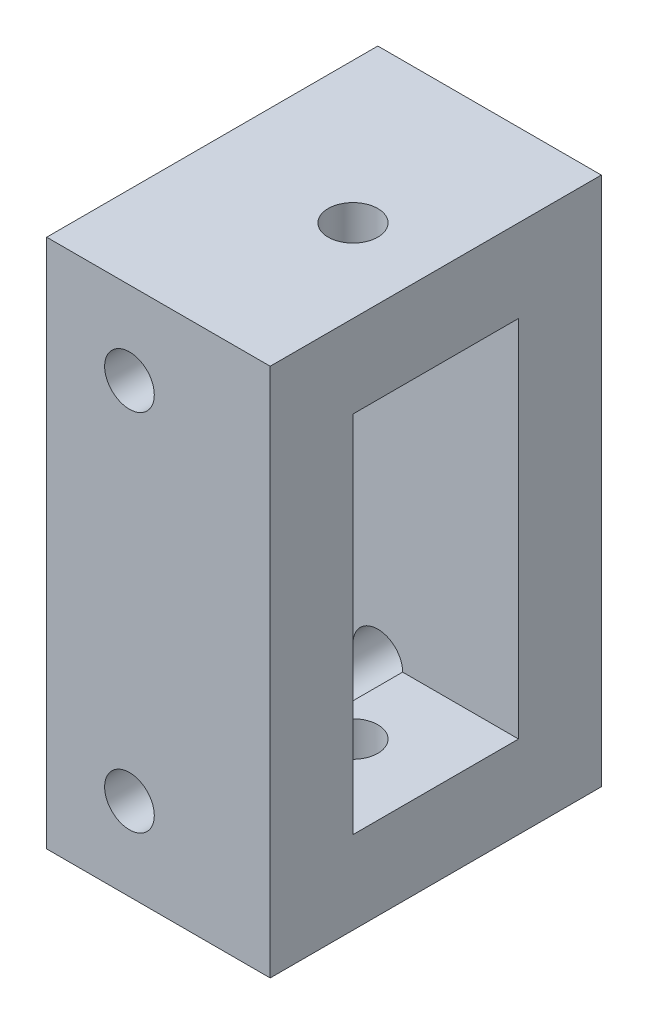
ISO-10303-21;
HEADER;
FILE_DESCRIPTION(('STEP AP214'),'2;1');
FILE_NAME('part.step','',(''),(''),'','','');
FILE_SCHEMA(('AUTOMOTIVE_DESIGN { 1 0 10303 214 1 1 1 1 }'));
ENDSEC;
DATA;
#1=APPLICATION_CONTEXT('core data for automotive mechanical design processes');
#2=APPLICATION_PROTOCOL_DEFINITION('international standard','automotive_design',2000,#1);
#3=PRODUCT_CONTEXT('',#1,'mechanical');
#4=PRODUCT('Part','Part','',(#3));
#5=PRODUCT_RELATED_PRODUCT_CATEGORY('part','',(#4));
#6=PRODUCT_DEFINITION_FORMATION('','',#4);
#7=PRODUCT_DEFINITION_CONTEXT('part definition',#1,'design');
#8=PRODUCT_DEFINITION('design','',#6,#7);
#9=PRODUCT_DEFINITION_SHAPE('','',#8);
#10=(LENGTH_UNIT() NAMED_UNIT(*) SI_UNIT(.MILLI.,.METRE.));
#11=(NAMED_UNIT(*) PLANE_ANGLE_UNIT() SI_UNIT($,.RADIAN.));
#12=(NAMED_UNIT(*) SI_UNIT($,.STERADIAN.) SOLID_ANGLE_UNIT());
#13=UNCERTAINTY_MEASURE_WITH_UNIT(LENGTH_MEASURE(1.E-05),#10,'distance_accuracy_value','');
#14=(GEOMETRIC_REPRESENTATION_CONTEXT(3) GLOBAL_UNCERTAINTY_ASSIGNED_CONTEXT((#13)) GLOBAL_UNIT_ASSIGNED_CONTEXT((#10,
#11,#12)) REPRESENTATION_CONTEXT('',''));
#15=CARTESIAN_POINT('',(0.,0.,0.));
#16=DIRECTION('',(0.,0.,1.));
#17=DIRECTION('',(1.,0.,0.));
#18=AXIS2_PLACEMENT_3D('',#15,#16,#17);
#19=CARTESIAN_POINT('',(8.5,0.,10.));
#20=DIRECTION('',(0.,1.,0.));
#21=DIRECTION('',(0.,0.,1.));
#22=AXIS2_PLACEMENT_3D('',#19,#20,#21);
#23=CYLINDRICAL_SURFACE('',#22,1.5);
#24=CARTESIAN_POINT('',(8.5,27.,10.));
#25=DIRECTION('',(0.,1.,0.));
#26=DIRECTION('',(0.,0.,1.));
#27=AXIS2_PLACEMENT_3D('',#24,#25,#26);
#28=CIRCLE('',#27,1.5);
#29=CARTESIAN_POINT('',(8.5,27.,11.5));
#30=VERTEX_POINT('',#29);
#31=EDGE_CURVE('E172',#30,#30,#28,.F.);
#32=ORIENTED_EDGE('',*,*,#31,.T.);
#33=EDGE_LOOP('',(#32));
#34=FACE_BOUND('',#33,.T.);
#35=CARTESIAN_POINT('',(8.5,32.,10.));
#36=DIRECTION('',(0.,1.,0.));
#37=DIRECTION('',(0.,0.,1.));
#38=AXIS2_PLACEMENT_3D('',#35,#36,#37);
#39=CIRCLE('',#38,1.5);
#40=CARTESIAN_POINT('',(8.5,32.,11.5));
#41=VERTEX_POINT('',#40);
#42=EDGE_CURVE('E185',#41,#41,#39,.T.);
#43=ORIENTED_EDGE('',*,*,#42,.T.);
#44=EDGE_LOOP('',(#43));
#45=FACE_BOUND('',#44,.T.);
#46=ADVANCED_FACE('F33',(#34,#45),#23,.F.);
#47=CARTESIAN_POINT('',(0.,32.,0.));
#48=DIRECTION('',(1.,0.,0.));
#49=DIRECTION('',(0.,0.,-1.));
#50=AXIS2_PLACEMENT_3D('',#47,#48,#49);
#51=PLANE('',#50);
#52=DIRECTION('',(0.,0.,1.));
#53=VECTOR('',#52,1.);
#54=CARTESIAN_POINT('',(0.,27.,15.));
#55=LINE('',#54,#53);
#56=CARTESIAN_POINT('',(0.,27.,5.));
#57=VERTEX_POINT('',#56);
#58=CARTESIAN_POINT('',(0.,27.,15.));
#59=VERTEX_POINT('',#58);
#60=EDGE_CURVE('E143',#57,#59,#55,.T.);
#61=ORIENTED_EDGE('',*,*,#60,.T.);
#62=DIRECTION('',(0.,-1.,0.));
#63=VECTOR('',#62,1.);
#64=CARTESIAN_POINT('',(0.,27.,15.));
#65=LINE('',#64,#63);
#66=CARTESIAN_POINT('',(0.,5.,15.));
#67=VERTEX_POINT('',#66);
#68=EDGE_CURVE('E128',#59,#67,#65,.T.);
#69=ORIENTED_EDGE('',*,*,#68,.T.);
#70=DIRECTION('',(0.,0.,-1.));
#71=VECTOR('',#70,1.);
#72=CARTESIAN_POINT('',(0.,5.,15.));
#73=LINE('',#72,#71);
#74=CARTESIAN_POINT('',(0.,5.,5.));
#75=VERTEX_POINT('',#74);
#76=EDGE_CURVE('E136',#67,#75,#73,.T.);
#77=ORIENTED_EDGE('',*,*,#76,.T.);
#78=DIRECTION('',(0.,1.,0.));
#79=VECTOR('',#78,1.);
#80=CARTESIAN_POINT('',(0.,27.,5.));
#81=LINE('',#80,#79);
#82=EDGE_CURVE('E48',#75,#57,#81,.T.);
#83=ORIENTED_EDGE('',*,*,#82,.T.);
#84=EDGE_LOOP('',(#61,#69,#77,#83));
#85=FACE_BOUND('',#84,.T.);
#86=DIRECTION('',(0.,0.,1.));
#87=VECTOR('',#86,1.);
#88=CARTESIAN_POINT('',(0.,0.,0.));
#89=LINE('',#88,#87);
#90=CARTESIAN_POINT('',(0.,0.,0.));
#91=VERTEX_POINT('',#90);
#92=CARTESIAN_POINT('',(0.,0.,20.));
#93=VERTEX_POINT('',#92);
#94=EDGE_CURVE('E201',#91,#93,#89,.T.);
#95=ORIENTED_EDGE('',*,*,#94,.T.);
#96=DIRECTION('',(0.,-1.,0.));
#97=VECTOR('',#96,1.);
#98=CARTESIAN_POINT('',(0.,32.,20.));
#99=LINE('',#98,#97);
#100=CARTESIAN_POINT('',(0.,32.,20.));
#101=VERTEX_POINT('',#100);
#102=EDGE_CURVE('E230',#101,#93,#99,.T.);
#103=ORIENTED_EDGE('',*,*,#102,.F.);
#104=DIRECTION('',(0.,0.,1.));
#105=VECTOR('',#104,1.);
#106=CARTESIAN_POINT('',(0.,32.,0.));
#107=LINE('',#106,#105);
#108=CARTESIAN_POINT('',(0.,32.,0.));
#109=VERTEX_POINT('',#108);
#110=EDGE_CURVE('E204',#109,#101,#107,.T.);
#111=ORIENTED_EDGE('',*,*,#110,.F.);
#112=DIRECTION('',(0.,-1.,0.));
#113=VECTOR('',#112,1.);
#114=CARTESIAN_POINT('',(0.,32.,0.));
#115=LINE('',#114,#113);
#116=EDGE_CURVE('E214',#109,#91,#115,.T.);
#117=ORIENTED_EDGE('',*,*,#116,.T.);
#118=EDGE_LOOP('',(#95,#103,#111,#117));
#119=FACE_BOUND('',#118,.T.);
#120=ADVANCED_FACE('F35',(#85,#119),#51,.F.);
#121=CARTESIAN_POINT('',(0.,32.,20.));
#122=DIRECTION('',(0.,0.,-1.));
#123=DIRECTION('',(-1.,0.,0.));
#124=AXIS2_PLACEMENT_3D('',#121,#122,#123);
#125=PLANE('',#124);
#126=CARTESIAN_POINT('',(5.00000000000055,5.,20.));
#127=DIRECTION('',(0.,0.,1.));
#128=DIRECTION('',(1.,0.,0.));
#129=AXIS2_PLACEMENT_3D('',#126,#127,#128);
#130=CIRCLE('',#129,1.5);
#131=CARTESIAN_POINT('',(6.50000000000055,5.,20.));
#132=VERTEX_POINT('',#131);
#133=EDGE_CURVE('E189',#132,#132,#130,.T.);
#134=ORIENTED_EDGE('',*,*,#133,.F.);
#135=EDGE_LOOP('',(#134));
#136=FACE_BOUND('',#135,.T.);
#137=CARTESIAN_POINT('',(5.00000000000001,27.,20.));
#138=DIRECTION('',(0.,0.,1.));
#139=DIRECTION('',(1.,0.,0.));
#140=AXIS2_PLACEMENT_3D('',#137,#138,#139);
#141=CIRCLE('',#140,1.5);
#142=CARTESIAN_POINT('',(6.50000000000001,27.,20.));
#143=VERTEX_POINT('',#142);
#144=EDGE_CURVE('E195',#143,#143,#141,.T.);
#145=ORIENTED_EDGE('',*,*,#144,.F.);
#146=EDGE_LOOP('',(#145));
#147=FACE_BOUND('',#146,.T.);
#148=DIRECTION('',(1.,0.,0.));
#149=VECTOR('',#148,1.);
#150=CARTESIAN_POINT('',(0.,0.,20.));
#151=LINE('',#150,#149);
#152=CARTESIAN_POINT('',(13.5,0.,20.));
#153=VERTEX_POINT('',#152);
#154=EDGE_CURVE('E217',#93,#153,#151,.T.);
#155=ORIENTED_EDGE('',*,*,#154,.T.);
#156=DIRECTION('',(0.,-1.,0.));
#157=VECTOR('',#156,1.);
#158=CARTESIAN_POINT('',(13.5,32.,20.));
#159=LINE('',#158,#157);
#160=CARTESIAN_POINT('',(13.5,32.,20.));
#161=VERTEX_POINT('',#160);
#162=EDGE_CURVE('E227',#161,#153,#159,.T.);
#163=ORIENTED_EDGE('',*,*,#162,.F.);
#164=DIRECTION('',(1.,0.,0.));
#165=VECTOR('',#164,1.);
#166=CARTESIAN_POINT('',(0.,32.,20.));
#167=LINE('',#166,#165);
#168=EDGE_CURVE('E207',#101,#161,#167,.T.);
#169=ORIENTED_EDGE('',*,*,#168,.F.);
#170=ORIENTED_EDGE('',*,*,#102,.T.);
#171=EDGE_LOOP('',(#155,#163,#169,#170));
#172=FACE_BOUND('',#171,.T.);
#173=ADVANCED_FACE('F274',(#136,#147,#172),#125,.F.);
#174=CARTESIAN_POINT('',(13.5,32.,0.));
#175=DIRECTION('',(-1.,0.,0.));
#176=DIRECTION('',(0.,0.,1.));
#177=AXIS2_PLACEMENT_3D('',#174,#175,#176);
#178=PLANE('',#177);
#179=DIRECTION('',(0.,0.,-1.));
#180=VECTOR('',#179,1.);
#181=CARTESIAN_POINT('',(13.5,5.,15.));
#182=LINE('',#181,#180);
#183=CARTESIAN_POINT('',(13.5,5.,15.));
#184=VERTEX_POINT('',#183);
#185=CARTESIAN_POINT('',(13.5,5.,5.));
#186=VERTEX_POINT('',#185);
#187=EDGE_CURVE('E153',#184,#186,#182,.T.);
#188=ORIENTED_EDGE('',*,*,#187,.F.);
#189=DIRECTION('',(0.,-1.,0.));
#190=VECTOR('',#189,1.);
#191=CARTESIAN_POINT('',(13.5,27.,15.));
#192=LINE('',#191,#190);
#193=CARTESIAN_POINT('',(13.5,27.,15.));
#194=VERTEX_POINT('',#193);
#195=EDGE_CURVE('E56',#194,#184,#192,.T.);
#196=ORIENTED_EDGE('',*,*,#195,.F.);
#197=DIRECTION('',(0.,0.,1.));
#198=VECTOR('',#197,1.);
#199=CARTESIAN_POINT('',(13.5,27.,15.));
#200=LINE('',#199,#198);
#201=CARTESIAN_POINT('',(13.5,27.,5.));
#202=VERTEX_POINT('',#201);
#203=EDGE_CURVE('E144',#202,#194,#200,.T.);
#204=ORIENTED_EDGE('',*,*,#203,.F.);
#205=DIRECTION('',(0.,1.,0.));
#206=VECTOR('',#205,1.);
#207=CARTESIAN_POINT('',(13.5,27.,5.));
#208=LINE('',#207,#206);
#209=EDGE_CURVE('E147',#186,#202,#208,.T.);
#210=ORIENTED_EDGE('',*,*,#209,.F.);
#211=EDGE_LOOP('',(#188,#196,#204,#210));
#212=FACE_BOUND('',#211,.T.);
#213=DIRECTION('',(0.,0.,-1.));
#214=VECTOR('',#213,1.);
#215=CARTESIAN_POINT('',(13.5,0.,0.));
#216=LINE('',#215,#214);
#217=CARTESIAN_POINT('',(13.5,0.,0.));
#218=VERTEX_POINT('',#217);
#219=EDGE_CURVE('E219',#153,#218,#216,.T.);
#220=ORIENTED_EDGE('',*,*,#219,.T.);
#221=DIRECTION('',(0.,-1.,0.));
#222=VECTOR('',#221,1.);
#223=CARTESIAN_POINT('',(13.5,32.,0.));
#224=LINE('',#223,#222);
#225=CARTESIAN_POINT('',(13.5,32.,0.));
#226=VERTEX_POINT('',#225);
#227=EDGE_CURVE('E224',#226,#218,#224,.T.);
#228=ORIENTED_EDGE('',*,*,#227,.F.);
#229=DIRECTION('',(0.,0.,-1.));
#230=VECTOR('',#229,1.);
#231=CARTESIAN_POINT('',(13.5,32.,0.));
#232=LINE('',#231,#230);
#233=EDGE_CURVE('E210',#161,#226,#232,.T.);
#234=ORIENTED_EDGE('',*,*,#233,.F.);
#235=ORIENTED_EDGE('',*,*,#162,.T.);
#236=EDGE_LOOP('',(#220,#228,#234,#235));
#237=FACE_BOUND('',#236,.T.);
#238=ADVANCED_FACE('F248',(#212,#237),#178,.F.);
#239=CARTESIAN_POINT('',(0.,32.,0.));
#240=DIRECTION('',(0.,0.,1.));
#241=DIRECTION('',(1.,0.,0.));
#242=AXIS2_PLACEMENT_3D('',#239,#240,#241);
#243=PLANE('',#242);
#244=CARTESIAN_POINT('',(5.00000000000055,5.,0.));
#245=DIRECTION('',(0.,0.,1.));
#246=DIRECTION('',(1.,0.,0.));
#247=AXIS2_PLACEMENT_3D('',#244,#245,#246);
#248=CIRCLE('',#247,1.5);
#249=CARTESIAN_POINT('',(6.50000000000055,5.,0.));
#250=VERTEX_POINT('',#249);
#251=EDGE_CURVE('E192',#250,#250,#248,.T.);
#252=ORIENTED_EDGE('',*,*,#251,.T.);
#253=EDGE_LOOP('',(#252));
#254=FACE_BOUND('',#253,.T.);
#255=CARTESIAN_POINT('',(5.00000000000001,27.,0.));
#256=DIRECTION('',(0.,0.,1.));
#257=DIRECTION('',(1.,0.,0.));
#258=AXIS2_PLACEMENT_3D('',#255,#256,#257);
#259=CIRCLE('',#258,1.5);
#260=CARTESIAN_POINT('',(6.50000000000001,27.,0.));
#261=VERTEX_POINT('',#260);
#262=EDGE_CURVE('E198',#261,#261,#259,.T.);
#263=ORIENTED_EDGE('',*,*,#262,.T.);
#264=EDGE_LOOP('',(#263));
#265=FACE_BOUND('',#264,.T.);
#266=DIRECTION('',(-1.,0.,0.));
#267=VECTOR('',#266,1.);
#268=CARTESIAN_POINT('',(0.,0.,0.));
#269=LINE('',#268,#267);
#270=EDGE_CURVE('E208',#218,#91,#269,.T.);
#271=ORIENTED_EDGE('',*,*,#270,.T.);
#272=ORIENTED_EDGE('',*,*,#116,.F.);
#273=DIRECTION('',(-1.,0.,0.));
#274=VECTOR('',#273,1.);
#275=CARTESIAN_POINT('',(0.,32.,0.));
#276=LINE('',#275,#274);
#277=EDGE_CURVE('E212',#226,#109,#276,.T.);
#278=ORIENTED_EDGE('',*,*,#277,.F.);
#279=ORIENTED_EDGE('',*,*,#227,.T.);
#280=EDGE_LOOP('',(#271,#272,#278,#279));
#281=FACE_BOUND('',#280,.T.);
#282=ADVANCED_FACE('F301',(#254,#265,#281),#243,.F.);
#283=CARTESIAN_POINT('',(0.,32.,0.));
#284=DIRECTION('',(0.,1.,0.));
#285=DIRECTION('',(0.,0.,1.));
#286=AXIS2_PLACEMENT_3D('',#283,#284,#285);
#287=PLANE('',#286);
#288=ORIENTED_EDGE('',*,*,#42,.F.);
#289=EDGE_LOOP('',(#288));
#290=FACE_BOUND('',#289,.T.);
#291=ORIENTED_EDGE('',*,*,#110,.T.);
#292=ORIENTED_EDGE('',*,*,#168,.T.);
#293=ORIENTED_EDGE('',*,*,#233,.T.);
#294=ORIENTED_EDGE('',*,*,#277,.T.);
#295=EDGE_LOOP('',(#291,#292,#293,#294));
#296=FACE_BOUND('',#295,.T.);
#297=ADVANCED_FACE('F291',(#290,#296),#287,.T.);
#298=CARTESIAN_POINT('',(0.,0.,0.));
#299=DIRECTION('',(0.,1.,0.));
#300=DIRECTION('',(0.,0.,1.));
#301=AXIS2_PLACEMENT_3D('',#298,#299,#300);
#302=PLANE('',#301);
#303=CARTESIAN_POINT('',(8.5,0.,10.));
#304=DIRECTION('',(0.,1.,0.));
#305=DIRECTION('',(0.,0.,1.));
#306=AXIS2_PLACEMENT_3D('',#303,#304,#305);
#307=CIRCLE('',#306,1.5);
#308=CARTESIAN_POINT('',(8.5,0.,11.5));
#309=VERTEX_POINT('',#308);
#310=EDGE_CURVE('E186',#309,#309,#307,.T.);
#311=ORIENTED_EDGE('',*,*,#310,.T.);
#312=EDGE_LOOP('',(#311));
#313=FACE_BOUND('',#312,.T.);
#314=ORIENTED_EDGE('',*,*,#94,.F.);
#315=ORIENTED_EDGE('',*,*,#270,.F.);
#316=ORIENTED_EDGE('',*,*,#219,.F.);
#317=ORIENTED_EDGE('',*,*,#154,.F.);
#318=EDGE_LOOP('',(#314,#315,#316,#317));
#319=FACE_BOUND('',#318,.T.);
#320=ADVANCED_FACE('F288',(#313,#319),#302,.F.);
#321=CARTESIAN_POINT('',(5.00000000000001,27.,0.));
#322=DIRECTION('',(0.,0.,1.));
#323=DIRECTION('',(1.,0.,0.));
#324=AXIS2_PLACEMENT_3D('',#321,#322,#323);
#325=CYLINDRICAL_SURFACE('',#324,1.5);
#326=DIRECTION('',(0.,0.,1.));
#327=VECTOR('',#326,1.);
#328=CARTESIAN_POINT('',(6.50000000000001,27.,0.));
#329=LINE('',#328,#327);
#330=CARTESIAN_POINT('',(6.50000000000001,27.,5.));
#331=VERTEX_POINT('',#330);
#332=CARTESIAN_POINT('',(6.50000000000001,27.,15.));
#333=VERTEX_POINT('',#332);
#334=EDGE_CURVE('E173',#331,#333,#329,.T.);
#335=ORIENTED_EDGE('',*,*,#334,.T.);
#336=CARTESIAN_POINT('',(5.00000000000001,27.,15.));
#337=DIRECTION('',(0.,0.,1.));
#338=DIRECTION('',(1.,0.,0.));
#339=AXIS2_PLACEMENT_3D('',#336,#337,#338);
#340=CIRCLE('',#339,1.5);
#341=CARTESIAN_POINT('',(3.50000000000001,27.,15.));
#342=VERTEX_POINT('',#341);
#343=EDGE_CURVE('E182',#333,#342,#340,.F.);
#344=ORIENTED_EDGE('',*,*,#343,.T.);
#345=DIRECTION('',(0.,0.,1.));
#346=VECTOR('',#345,1.);
#347=CARTESIAN_POINT('',(3.50000000000001,27.,0.));
#348=LINE('',#347,#346);
#349=CARTESIAN_POINT('',(3.50000000000001,27.,5.));
#350=VERTEX_POINT('',#349);
#351=EDGE_CURVE('E176',#342,#350,#348,.F.);
#352=ORIENTED_EDGE('',*,*,#351,.T.);
#353=CARTESIAN_POINT('',(5.00000000000001,27.,5.));
#354=DIRECTION('',(0.,0.,-1.));
#355=DIRECTION('',(-1.,0.,0.));
#356=AXIS2_PLACEMENT_3D('',#353,#354,#355);
#357=CIRCLE('',#356,1.5);
#358=EDGE_CURVE('E179',#350,#331,#357,.F.);
#359=ORIENTED_EDGE('',*,*,#358,.T.);
#360=EDGE_LOOP('',(#335,#344,#352,#359));
#361=FACE_BOUND('',#360,.T.);
#362=ORIENTED_EDGE('',*,*,#262,.F.);
#363=EDGE_LOOP('',(#362));
#364=FACE_BOUND('',#363,.T.);
#365=ORIENTED_EDGE('',*,*,#144,.T.);
#366=EDGE_LOOP('',(#365));
#367=FACE_BOUND('',#366,.T.);
#368=ADVANCED_FACE('F255',(#361,#364,#367),#325,.F.);
#369=CARTESIAN_POINT('',(5.00000000000055,5.,0.));
#370=DIRECTION('',(0.,0.,1.));
#371=DIRECTION('',(1.,0.,0.));
#372=AXIS2_PLACEMENT_3D('',#369,#370,#371);
#373=CYLINDRICAL_SURFACE('',#372,1.5);
#374=CARTESIAN_POINT('',(5.00000000000055,5.,15.));
#375=DIRECTION('',(0.,0.,1.));
#376=DIRECTION('',(1.,0.,0.));
#377=AXIS2_PLACEMENT_3D('',#374,#375,#376);
#378=CIRCLE('',#377,1.5);
#379=CARTESIAN_POINT('',(3.50000000000055,5.,15.));
#380=VERTEX_POINT('',#379);
#381=CARTESIAN_POINT('',(6.50000000000055,5.,15.));
#382=VERTEX_POINT('',#381);
#383=EDGE_CURVE('E11',#380,#382,#378,.F.);
#384=ORIENTED_EDGE('',*,*,#383,.T.);
#385=DIRECTION('',(0.,0.,1.));
#386=VECTOR('',#385,1.);
#387=CARTESIAN_POINT('',(6.50000000000055,5.,0.));
#388=LINE('',#387,#386);
#389=CARTESIAN_POINT('',(6.50000000000055,5.,5.));
#390=VERTEX_POINT('',#389);
#391=EDGE_CURVE('E169',#382,#390,#388,.F.);
#392=ORIENTED_EDGE('',*,*,#391,.T.);
#393=CARTESIAN_POINT('',(5.00000000000055,5.,5.));
#394=DIRECTION('',(0.,0.,-1.));
#395=DIRECTION('',(-1.,0.,0.));
#396=AXIS2_PLACEMENT_3D('',#393,#394,#395);
#397=CIRCLE('',#396,1.5);
#398=CARTESIAN_POINT('',(3.50000000000055,5.,5.));
#399=VERTEX_POINT('',#398);
#400=EDGE_CURVE('E41',#390,#399,#397,.F.);
#401=ORIENTED_EDGE('',*,*,#400,.T.);
#402=DIRECTION('',(0.,0.,1.));
#403=VECTOR('',#402,1.);
#404=CARTESIAN_POINT('',(3.50000000000055,5.,0.));
#405=LINE('',#404,#403);
#406=EDGE_CURVE('E167',#399,#380,#405,.T.);
#407=ORIENTED_EDGE('',*,*,#406,.T.);
#408=EDGE_LOOP('',(#384,#392,#401,#407));
#409=FACE_BOUND('',#408,.T.);
#410=ORIENTED_EDGE('',*,*,#251,.F.);
#411=EDGE_LOOP('',(#410));
#412=FACE_BOUND('',#411,.T.);
#413=ORIENTED_EDGE('',*,*,#133,.T.);
#414=EDGE_LOOP('',(#413));
#415=FACE_BOUND('',#414,.T.);
#416=ADVANCED_FACE('F238',(#409,#412,#415),#373,.F.);
#417=CARTESIAN_POINT('',(8.5,5.,10.));
#418=DIRECTION('',(0.,-1.,0.));
#419=DIRECTION('',(0.,0.,-1.));
#420=AXIS2_PLACEMENT_3D('',#417,#418,#419);
#421=CIRCLE('',#420,1.5);
#422=CARTESIAN_POINT('',(8.5,5.,8.5));
#423=VERTEX_POINT('',#422);
#424=EDGE_CURVE('E160',#423,#423,#421,.F.);
#425=ORIENTED_EDGE('',*,*,#424,.T.);
#426=EDGE_LOOP('',(#425));
#427=FACE_BOUND('',#426,.T.);
#428=ORIENTED_EDGE('',*,*,#310,.F.);
#429=EDGE_LOOP('',(#428));
#430=FACE_BOUND('',#429,.T.);
#431=ADVANCED_FACE('F270',(#427,#430),#23,.F.);
#432=CARTESIAN_POINT('',(0.,27.,15.));
#433=DIRECTION('',(0.,0.,1.));
#434=DIRECTION('',(1.,0.,0.));
#435=AXIS2_PLACEMENT_3D('',#432,#433,#434);
#436=PLANE('',#435);
#437=DIRECTION('',(1.,0.,0.));
#438=VECTOR('',#437,1.);
#439=CARTESIAN_POINT('',(0.,27.,15.));
#440=LINE('',#439,#438);
#441=EDGE_CURVE('E161',#333,#194,#440,.T.);
#442=ORIENTED_EDGE('',*,*,#441,.T.);
#443=ORIENTED_EDGE('',*,*,#195,.T.);
#444=DIRECTION('',(1.,0.,0.));
#445=VECTOR('',#444,1.);
#446=CARTESIAN_POINT('',(0.,5.,15.));
#447=LINE('',#446,#445);
#448=EDGE_CURVE('E133',#382,#184,#447,.T.);
#449=ORIENTED_EDGE('',*,*,#448,.F.);
#450=ORIENTED_EDGE('',*,*,#383,.F.);
#451=EDGE_CURVE('E123',#67,#380,#447,.T.);
#452=ORIENTED_EDGE('',*,*,#451,.F.);
#453=ORIENTED_EDGE('',*,*,#68,.F.);
#454=EDGE_CURVE('E158',#59,#342,#440,.T.);
#455=ORIENTED_EDGE('',*,*,#454,.T.);
#456=ORIENTED_EDGE('',*,*,#343,.F.);
#457=EDGE_LOOP('',(#442,#443,#449,#450,#452,#453,#455,#456));
#458=FACE_BOUND('',#457,.T.);
#459=ADVANCED_FACE('F125',(#458),#436,.F.);
#460=CARTESIAN_POINT('',(0.,27.,5.));
#461=DIRECTION('',(0.,0.,-1.));
#462=DIRECTION('',(-1.,0.,0.));
#463=AXIS2_PLACEMENT_3D('',#460,#461,#462);
#464=PLANE('',#463);
#465=DIRECTION('',(1.,0.,0.));
#466=VECTOR('',#465,1.);
#467=CARTESIAN_POINT('',(0.,27.,5.));
#468=LINE('',#467,#466);
#469=EDGE_CURVE('E162',#57,#350,#468,.T.);
#470=ORIENTED_EDGE('',*,*,#469,.F.);
#471=ORIENTED_EDGE('',*,*,#82,.F.);
#472=DIRECTION('',(1.,0.,0.));
#473=VECTOR('',#472,1.);
#474=CARTESIAN_POINT('',(0.,5.,5.));
#475=LINE('',#474,#473);
#476=EDGE_CURVE('E138',#75,#399,#475,.T.);
#477=ORIENTED_EDGE('',*,*,#476,.T.);
#478=ORIENTED_EDGE('',*,*,#400,.F.);
#479=EDGE_CURVE('E132',#390,#186,#475,.T.);
#480=ORIENTED_EDGE('',*,*,#479,.T.);
#481=ORIENTED_EDGE('',*,*,#209,.T.);
#482=EDGE_CURVE('E165',#331,#202,#468,.T.);
#483=ORIENTED_EDGE('',*,*,#482,.F.);
#484=ORIENTED_EDGE('',*,*,#358,.F.);
#485=EDGE_LOOP('',(#470,#471,#477,#478,#480,#481,#483,#484));
#486=FACE_BOUND('',#485,.T.);
#487=ADVANCED_FACE('F241',(#486),#464,.F.);
#488=CARTESIAN_POINT('',(0.,27.,15.));
#489=DIRECTION('',(0.,1.,0.));
#490=DIRECTION('',(0.,0.,1.));
#491=AXIS2_PLACEMENT_3D('',#488,#489,#490);
#492=PLANE('',#491);
#493=ORIENTED_EDGE('',*,*,#454,.F.);
#494=ORIENTED_EDGE('',*,*,#60,.F.);
#495=ORIENTED_EDGE('',*,*,#469,.T.);
#496=ORIENTED_EDGE('',*,*,#351,.F.);
#497=EDGE_LOOP('',(#493,#494,#495,#496));
#498=FACE_BOUND('',#497,.T.);
#499=ADVANCED_FACE('F258',(#498),#492,.F.);
#500=ORIENTED_EDGE('',*,*,#31,.F.);
#501=EDGE_LOOP('',(#500));
#502=FACE_BOUND('',#501,.T.);
#503=ORIENTED_EDGE('',*,*,#482,.T.);
#504=ORIENTED_EDGE('',*,*,#203,.T.);
#505=ORIENTED_EDGE('',*,*,#441,.F.);
#506=ORIENTED_EDGE('',*,*,#334,.F.);
#507=EDGE_LOOP('',(#503,#504,#505,#506));
#508=FACE_BOUND('',#507,.T.);
#509=ADVANCED_FACE('F253',(#502,#508),#492,.F.);
#510=CARTESIAN_POINT('',(0.,5.,15.));
#511=DIRECTION('',(0.,-1.,0.));
#512=DIRECTION('',(0.,0.,-1.));
#513=AXIS2_PLACEMENT_3D('',#510,#511,#512);
#514=PLANE('',#513);
#515=ORIENTED_EDGE('',*,*,#424,.F.);
#516=EDGE_LOOP('',(#515));
#517=FACE_BOUND('',#516,.T.);
#518=ORIENTED_EDGE('',*,*,#448,.T.);
#519=ORIENTED_EDGE('',*,*,#187,.T.);
#520=ORIENTED_EDGE('',*,*,#479,.F.);
#521=ORIENTED_EDGE('',*,*,#391,.F.);
#522=EDGE_LOOP('',(#518,#519,#520,#521));
#523=FACE_BOUND('',#522,.T.);
#524=ADVANCED_FACE('F243',(#517,#523),#514,.F.);
#525=ORIENTED_EDGE('',*,*,#476,.F.);
#526=ORIENTED_EDGE('',*,*,#76,.F.);
#527=ORIENTED_EDGE('',*,*,#451,.T.);
#528=ORIENTED_EDGE('',*,*,#406,.F.);
#529=EDGE_LOOP('',(#525,#526,#527,#528));
#530=FACE_BOUND('',#529,.T.);
#531=ADVANCED_FACE('F137',(#530),#514,.F.);
#532=CLOSED_SHELL('',(#46,#120,#173,#238,#282,#297,#320,#368,#416,#431,#459,#487,#499,#509,#524,#531));
#533=MANIFOLD_SOLID_BREP('B2',#532);
#534=ADVANCED_BREP_SHAPE_REPRESENTATION('',(#18,#533),#14);
#535=SHAPE_DEFINITION_REPRESENTATION(#9,#534);
ENDSEC;
END-ISO-10303-21;
